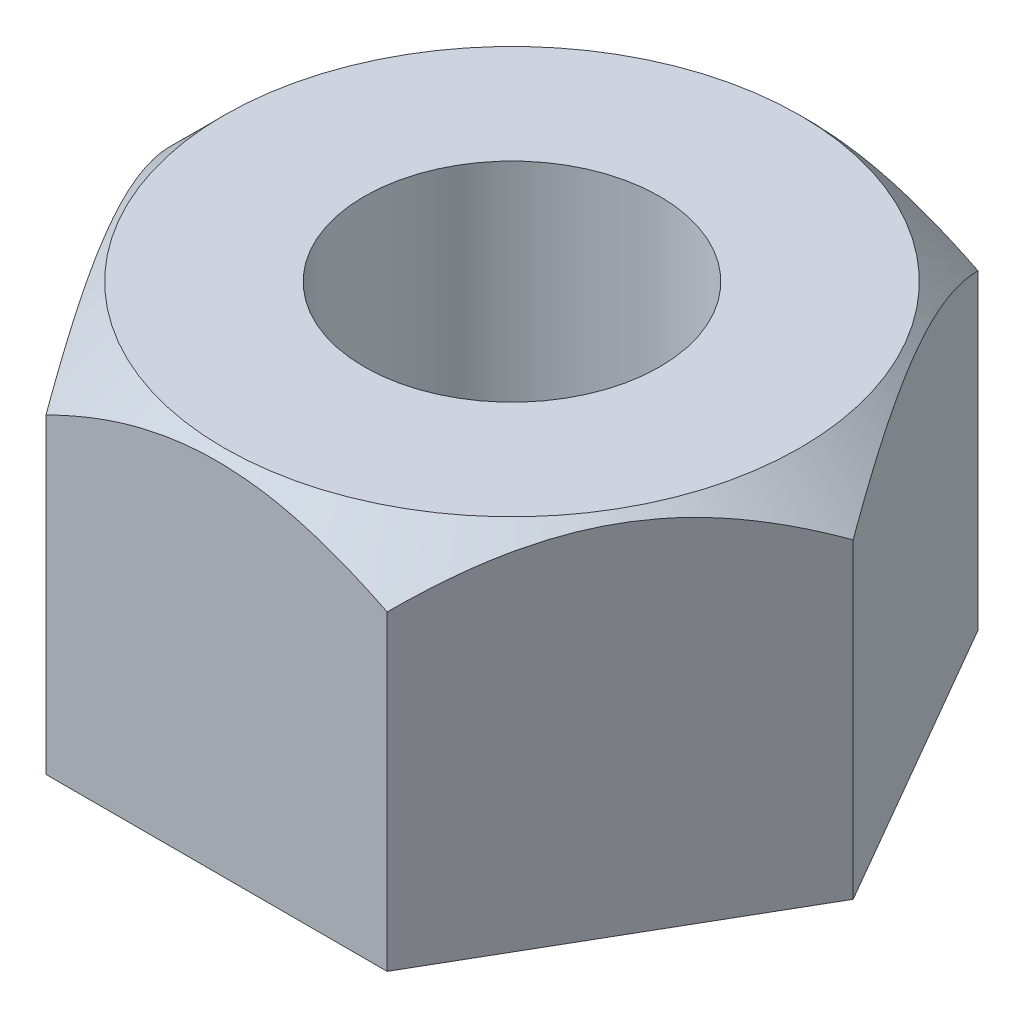
ISO-10303-21;
HEADER;
FILE_DESCRIPTION(('STEP AP214'),'2;1');
FILE_NAME('part.step','',(''),(''),'','','');
FILE_SCHEMA(('AUTOMOTIVE_DESIGN { 1 0 10303 214 1 1 1 1 }'));
ENDSEC;
DATA;
#1=APPLICATION_CONTEXT('core data for automotive mechanical design processes');
#2=APPLICATION_PROTOCOL_DEFINITION('international standard','automotive_design',2000,#1);
#3=PRODUCT_CONTEXT('',#1,'mechanical');
#4=PRODUCT('Part','Part','',(#3));
#5=PRODUCT_RELATED_PRODUCT_CATEGORY('part','',(#4));
#6=PRODUCT_DEFINITION_FORMATION('','',#4);
#7=PRODUCT_DEFINITION_CONTEXT('part definition',#1,'design');
#8=PRODUCT_DEFINITION('design','',#6,#7);
#9=PRODUCT_DEFINITION_SHAPE('','',#8);
#10=(LENGTH_UNIT() NAMED_UNIT(*) SI_UNIT(.MILLI.,.METRE.));
#11=(NAMED_UNIT(*) PLANE_ANGLE_UNIT() SI_UNIT($,.RADIAN.));
#12=(NAMED_UNIT(*) SI_UNIT($,.STERADIAN.) SOLID_ANGLE_UNIT());
#13=UNCERTAINTY_MEASURE_WITH_UNIT(LENGTH_MEASURE(1.E-05),#10,'distance_accuracy_value','');
#14=(GEOMETRIC_REPRESENTATION_CONTEXT(3) GLOBAL_UNCERTAINTY_ASSIGNED_CONTEXT((#13)) GLOBAL_UNIT_ASSIGNED_CONTEXT((#10,
#11,#12)) REPRESENTATION_CONTEXT('',''));
#15=CARTESIAN_POINT('',(0.,0.,0.));
#16=DIRECTION('',(0.,0.,1.));
#17=DIRECTION('',(1.,0.,0.));
#18=AXIS2_PLACEMENT_3D('',#15,#16,#17);
#19=CARTESIAN_POINT('',(0.,14.8,0.));
#20=DIRECTION('',(0.,1.,0.));
#21=DIRECTION('',(0.,0.,1.));
#22=AXIS2_PLACEMENT_3D('',#19,#20,#21);
#23=PLANE('',#22);
#24=CARTESIAN_POINT('',(0.,14.8,0.));
#25=DIRECTION('',(0.,1.,0.));
#26=DIRECTION('',(0.,0.,1.));
#27=AXIS2_PLACEMENT_3D('',#24,#25,#26);
#28=CIRCLE('',#27,6.);
#29=CARTESIAN_POINT('',(0.,14.8,6.));
#30=VERTEX_POINT('',#29);
#31=EDGE_CURVE('E153',#30,#30,#28,.T.);
#32=ORIENTED_EDGE('',*,*,#31,.F.);
#33=EDGE_LOOP('',(#32));
#34=FACE_BOUND('',#33,.T.);
#35=CARTESIAN_POINT('',(0.,14.8,0.));
#36=DIRECTION('',(0.,1.,0.));
#37=DIRECTION('',(0.,0.,1.));
#38=AXIS2_PLACEMENT_3D('',#35,#36,#37);
#39=CIRCLE('',#38,11.7);
#40=CARTESIAN_POINT('',(0.,14.8,11.7));
#41=VERTEX_POINT('',#40);
#42=EDGE_CURVE('E119',#41,#41,#39,.T.);
#43=ORIENTED_EDGE('',*,*,#42,.T.);
#44=EDGE_LOOP('',(#43));
#45=FACE_BOUND('',#44,.T.);
#46=ADVANCED_FACE('F55',(#34,#45),#23,.T.);
#47=CARTESIAN_POINT('',(6.92820323027558,14.8,-12.));
#48=DIRECTION('',(0.,0.,1.));
#49=DIRECTION('',(1.,0.,0.));
#50=AXIS2_PLACEMENT_3D('',#47,#48,#49);
#51=PLANE('',#50);
#52=CARTESIAN_POINT('',(-14.801412500091,7.44529422956486,-12.));
#53=CARTESIAN_POINT('',(-14.4450990872284,7.72201153026107,-12.));
#54=CARTESIAN_POINT('',(-14.0869052691551,7.99634489111884,-12.));
#55=CARTESIAN_POINT('',(-13.3659745275774,8.53914347458796,-12.));
#56=CARTESIAN_POINT('',(-13.0032365808891,8.80760733682356,-12.));
#57=CARTESIAN_POINT('',(-12.2697898339787,9.33947510440906,-12.));
#58=CARTESIAN_POINT('',(-11.8990411956306,9.60282424900944,-12.));
#59=CARTESIAN_POINT('',(-11.1514431459493,10.1206851252024,-12.));
#60=CARTESIAN_POINT('',(-10.7745941524791,10.3751974583757,-12.));
#61=CARTESIAN_POINT('',(-9.9883277604522,10.8899865053995,-12.));
#62=CARTESIAN_POINT('',(-9.57841641518277,11.14951253379,-12.));
#63=CARTESIAN_POINT('',(-8.74894806712837,11.652933114154,-12.));
#64=CARTESIAN_POINT('',(-8.32938940873377,11.8968249554727,-12.));
#65=CARTESIAN_POINT('',(-7.48043397523474,12.3638202415861,-12.));
#66=CARTESIAN_POINT('',(-7.05107095929579,12.5869845884765,-12.));
#67=CARTESIAN_POINT('',(-6.179988359866,13.0075245273671,-12.));
#68=CARTESIAN_POINT('',(-5.73827484835639,13.2049125304695,-12.));
#69=CARTESIAN_POINT('',(-4.88962319238687,13.5472255629299,-12.));
#70=CARTESIAN_POINT('',(-4.4840509613617,13.6955092491556,-12.));
#71=CARTESIAN_POINT('',(-3.66220026690907,13.9596409956595,-12.));
#72=CARTESIAN_POINT('',(-3.24592114793286,14.075487064699,-12.));
#73=CARTESIAN_POINT('',(-2.61903132937467,14.2191636497385,-12.));
#74=CARTESIAN_POINT('',(-2.41174791860351,14.2617582447969,-12.));
#75=CARTESIAN_POINT('',(-1.99538619814452,14.336954266384,-12.));
#76=CARTESIAN_POINT('',(-1.78630814978172,14.3695571233027,-12.));
#77=CARTESIAN_POINT('',(-1.36679404933553,14.4242029069739,-12.));
#78=CARTESIAN_POINT('',(-1.1563581354994,14.4462468920781,-12.));
#79=CARTESIAN_POINT('',(-0.734621944734772,14.4793724167482,-12.));
#80=CARTESIAN_POINT('',(-0.523321681191196,14.4904541254305,-12.));
#81=CARTESIAN_POINT('',(-0.110604144780084,14.501177353214,-12.));
#82=CARTESIAN_POINT('',(0.0907996117344343,14.5013435283368,-12.));
#83=CARTESIAN_POINT('',(0.493382262326179,14.4915477648453,-12.));
#84=CARTESIAN_POINT('',(0.694561128520425,14.4815846854314,-12.));
#85=CARTESIAN_POINT('',(1.09616438993495,14.4517018314411,-12.));
#86=CARTESIAN_POINT('',(1.29658883265054,14.4317826945877,-12.));
#87=CARTESIAN_POINT('',(1.6962575621275,14.3823303146465,-12.));
#88=CARTESIAN_POINT('',(1.89550168379105,14.3527957574866,-12.));
#89=CARTESIAN_POINT('',(2.49810838310559,14.2491914186656,-12.));
#90=CARTESIAN_POINT('',(2.89905404316259,14.1606853181106,-12.));
#91=CARTESIAN_POINT('',(3.69198154856619,13.9507279381252,-12.));
#92=CARTESIAN_POINT('',(4.08396376805102,13.8292780365163,-12.));
#93=CARTESIAN_POINT('',(4.87417783007714,13.5533826315198,-12.));
#94=CARTESIAN_POINT('',(5.27200353161047,13.3977854015761,-12.));
#95=CARTESIAN_POINT('',(6.05745310690751,13.0624974253596,-12.));
#96=CARTESIAN_POINT('',(6.4450723555116,12.8827959733822,-12.));
#97=CARTESIAN_POINT('',(7.21192138045324,12.503557457937,-12.));
#98=CARTESIAN_POINT('',(7.59112097676443,12.3039598559697,-12.));
#99=CARTESIAN_POINT('',(8.34084461503845,11.8893130198286,-12.));
#100=CARTESIAN_POINT('',(8.71136996298692,11.6742661317791,-12.));
#101=CARTESIAN_POINT('',(9.42679916335699,11.2426328306664,-12.));
#102=CARTESIAN_POINT('',(9.77206580095679,11.0266445609616,-12.));
#103=CARTESIAN_POINT('',(10.4566659285482,10.5854343964853,-12.));
#104=CARTESIAN_POINT('',(10.7959989733113,10.3602118130199,-12.));
#105=CARTESIAN_POINT('',(11.4667906374197,9.90400044379855,-12.));
#106=CARTESIAN_POINT('',(11.7982905056502,9.67307209021432,-12.));
#107=CARTESIAN_POINT('',(12.4567365082155,9.20499456707331,-12.));
#108=CARTESIAN_POINT('',(12.7836838730967,8.96784713055429,-12.));
#109=CARTESIAN_POINT('',(13.1087202789976,8.72815295606545,-12.));
#110=B_SPLINE_CURVE_WITH_KNOTS('',3,(#52,#53,#54,#55,#56,#57,#58,#59,#60,#61,#62,#63,#64,#65,
#66,#67,#68,#69,#70,#71,#72,#73,#74,#75,#76,#77,#78,#79,#80,#81,#82,#83,#84,#85,#86,#87,#88,#89,
#90,#91,#92,#93,#94,#95,#96,#97,#98,#99,#100,#101,#102,#103,#104,#105,#106,#107,#108,#109),
.UNSPECIFIED.,.F.,.F.,(4,2,2,2,2,2,2,2,2,2,2,2,2,2,2,2,2,2,2,2,2,2,2,2,2,2,2,2,4),(0.,
1.35345851995285,2.70722747546976,4.07140305034779,5.43548557387311,6.89069127235449,
8.34614859573043,9.79718439558518,11.247518936881,12.5419494153501,13.8364593372402,
14.4711005682753,15.1056509033139,15.7401376218939,16.3746145520171,16.9785718174019,
17.582597110546,18.1865837185503,18.790652903841,20.0206411275807,21.2505779169717,
22.531105826439,23.8122043674222,25.0973273701481,26.3822556253048,27.6038609068686,
28.8255574619077,30.0374950118827,31.2490983532025),.UNSPECIFIED.);
#111=CARTESIAN_POINT('',(6.92820323027558,12.6435935394489,-12.));
#112=VERTEX_POINT('',#111);
#113=CARTESIAN_POINT('',(-6.92820323027552,12.6435935394489,-12.));
#114=VERTEX_POINT('',#113);
#115=EDGE_CURVE('E114',#112,#114,#110,.F.);
#116=ORIENTED_EDGE('',*,*,#115,.F.);
#117=DIRECTION('',(0.,-1.,0.));
#118=VECTOR('',#117,1.);
#119=CARTESIAN_POINT('',(6.92820323027558,14.8,-12.));
#120=LINE('',#119,#118);
#121=CARTESIAN_POINT('',(6.92820323027558,0.,-12.));
#122=VERTEX_POINT('',#121);
#123=EDGE_CURVE('E84',#112,#122,#120,.T.);
#124=ORIENTED_EDGE('',*,*,#123,.T.);
#125=DIRECTION('',(-1.,0.,0.));
#126=VECTOR('',#125,1.);
#127=CARTESIAN_POINT('',(6.92820323027558,0.,-12.));
#128=LINE('',#127,#126);
#129=CARTESIAN_POINT('',(-6.92820323027552,0.,-12.));
#130=VERTEX_POINT('',#129);
#131=EDGE_CURVE('E148',#122,#130,#128,.T.);
#132=ORIENTED_EDGE('',*,*,#131,.T.);
#133=DIRECTION('',(0.,-1.,0.));
#134=VECTOR('',#133,1.);
#135=CARTESIAN_POINT('',(-6.92820323027552,14.8,-12.));
#136=LINE('',#135,#134);
#137=EDGE_CURVE('E70',#114,#130,#136,.T.);
#138=ORIENTED_EDGE('',*,*,#137,.F.);
#139=EDGE_LOOP('',(#116,#124,#132,#138));
#140=FACE_BOUND('',#139,.T.);
#141=ADVANCED_FACE('F57',(#140),#51,.F.);
#142=CARTESIAN_POINT('',(-6.92820323027552,14.8,-12.));
#143=DIRECTION('',(0.866025403784439,0.,0.499999999999999));
#144=DIRECTION('',(0.499999999999999,0.,-0.866025403784439));
#145=AXIS2_PLACEMENT_3D('',#142,#143,#144);
#146=PLANE('',#145);
#147=CARTESIAN_POINT('',(-6.92808776022168,12.6434780679517,-12.0002));
#148=CARTESIAN_POINT('',(-7.04719877327456,12.7625714926538,-11.7938936736514));
#149=CARTESIAN_POINT('',(-7.16724261422503,12.8780308165856,-11.5859716419895));
#150=CARTESIAN_POINT('',(-7.40934115077743,13.1005268939468,-11.1666446762427));
#151=CARTESIAN_POINT('',(-7.5313969011812,13.2075590475927,-10.9552379151874));
#152=CARTESIAN_POINT('',(-7.77824013911251,13.4124996903972,-10.5276928855855));
#153=CARTESIAN_POINT('',(-7.90303926622942,13.510352431954,-10.3115344566788));
#154=CARTESIAN_POINT('',(-8.15468728442037,13.6948089974753,-9.87566730354805));
#155=CARTESIAN_POINT('',(-8.2815358587729,13.7814145412342,-9.6559591279018));
#156=CARTESIAN_POINT('',(-8.53524327762006,13.9406365264619,-9.21652498820136));
#157=CARTESIAN_POINT('',(-8.66207094520615,14.0134505386415,-8.99685302413679));
#158=CARTESIAN_POINT('',(-8.91750415833688,14.1452735919672,-8.55442972105379));
#159=CARTESIAN_POINT('',(-9.04610951090115,14.204284119307,-8.33167871628717));
#160=CARTESIAN_POINT('',(-9.30454801721049,14.3070145675144,-7.88405009272718));
#161=CARTESIAN_POINT('',(-9.43437771980113,14.3507689052205,-7.65917845150863));
#162=CARTESIAN_POINT('',(-9.69512706759185,14.4220255403133,-7.20754733309465));
#163=CARTESIAN_POINT('',(-9.82604654695932,14.4495302661784,-6.98078814312973));
#164=CARTESIAN_POINT('',(-10.1450873372795,14.4956480494336,-6.42819328460833));
#165=CARTESIAN_POINT('',(-10.3335534889187,14.5053256947163,-6.10176033446225));
#166=CARTESIAN_POINT('',(-10.7101449262483,14.4890810450968,-5.44948483131199));
#167=CARTESIAN_POINT('',(-10.8982700693165,14.4631462715612,-5.12364252533668));
#168=CARTESIAN_POINT('',(-11.272746976892,14.3772075994838,-4.47502949515454));
#169=CARTESIAN_POINT('',(-11.459096521137,14.3171656055892,-4.152262616555));
#170=CARTESIAN_POINT('',(-11.8285926127853,14.1662761774216,-3.51227661262201));
#171=CARTESIAN_POINT('',(-12.0117394046794,14.0754311054756,-3.19505706381805));
#172=CARTESIAN_POINT('',(-12.33684690702,13.8885415621697,-2.63195435184247));
#173=CARTESIAN_POINT('',(-12.4795277124444,13.7974135849289,-2.38482394758251));
#174=CARTESIAN_POINT('',(-12.7623282250606,13.6004736817299,-1.89499909132463));
#175=CARTESIAN_POINT('',(-12.9024478546601,13.4946613117313,-1.65230477372055));
#176=CARTESIAN_POINT('',(-13.1796846729289,13.2707242880093,-1.17211651875028));
#177=CARTESIAN_POINT('',(-13.3168097461332,13.1526383555986,-0.934608924968879));
#178=CARTESIAN_POINT('',(-13.5885209197265,12.90570429574,-0.463991367321183));
#179=CARTESIAN_POINT('',(-13.7231085155155,12.7768627663692,-0.230878813345964));
#180=CARTESIAN_POINT('',(-13.8565219306048,12.6434780679517,0.000199999999997512));
#181=B_SPLINE_CURVE_WITH_KNOTS('',3,(#147,#148,#149,#150,#151,#152,#153,#154,#155,#156,#157,
#158,#159,#160,#161,#162,#163,#164,#165,#166,#167,#168,#169,#170,#171,#172,#173,#174,#175,#176,
#177,#178,#179,#180),.UNSPECIFIED.,.F.,.F.,(4,2,2,2,2,2,2,2,2,2,2,2,2,2,2,2,4),(0.,
0.799031199908986,1.59849555255348,2.40253734668171,3.20645605070684,3.99780391077672,
4.78906652873795,5.57853238867789,6.36788023433998,7.4972868016245,8.62708921530181,
9.75815602658374,10.8891361145372,11.7873913517247,12.6856737571236,13.58120361047,
14.4761880775557),.UNSPECIFIED.);
#182=CARTESIAN_POINT('',(-13.856406460551,12.643593539449,0.));
#183=VERTEX_POINT('',#182);
#184=EDGE_CURVE('E120',#114,#183,#181,.T.);
#185=ORIENTED_EDGE('',*,*,#184,.F.);
#186=ORIENTED_EDGE('',*,*,#137,.T.);
#187=DIRECTION('',(-0.499999999999999,0.,0.866025403784439));
#188=VECTOR('',#187,1.);
#189=CARTESIAN_POINT('',(-6.92820323027552,0.,-12.));
#190=LINE('',#189,#188);
#191=CARTESIAN_POINT('',(-13.856406460551,0.,0.));
#192=VERTEX_POINT('',#191);
#193=EDGE_CURVE('E143',#130,#192,#190,.T.);
#194=ORIENTED_EDGE('',*,*,#193,.T.);
#195=DIRECTION('',(0.,-1.,0.));
#196=VECTOR('',#195,1.);
#197=CARTESIAN_POINT('',(-13.856406460551,14.8,0.));
#198=LINE('',#197,#196);
#199=EDGE_CURVE('E137',#183,#192,#198,.T.);
#200=ORIENTED_EDGE('',*,*,#199,.F.);
#201=EDGE_LOOP('',(#185,#186,#194,#200));
#202=FACE_BOUND('',#201,.T.);
#203=ADVANCED_FACE('F141',(#202),#146,.F.);
#204=CARTESIAN_POINT('',(-13.856406460551,14.8,0.));
#205=DIRECTION('',(0.86602540378444,0.,-0.499999999999998));
#206=DIRECTION('',(-0.499999999999998,0.,-0.86602540378444));
#207=AXIS2_PLACEMENT_3D('',#204,#205,#206);
#208=PLANE('',#207);
#209=CARTESIAN_POINT('',(-13.8565219306048,12.6434780679518,-0.000200000000003469));
#210=CARTESIAN_POINT('',(-13.737410917552,12.7625714926539,0.206106326348585));
#211=CARTESIAN_POINT('',(-13.6173670766015,12.8780308165856,0.414028358010507));
#212=CARTESIAN_POINT('',(-13.3752685400491,13.1005268939468,0.833355323757333));
#213=CARTESIAN_POINT('',(-13.2532127896453,13.2075590475927,1.04476208481262));
#214=CARTESIAN_POINT('',(-13.006369551714,13.4124996903972,1.47230711441446));
#215=CARTESIAN_POINT('',(-12.8815704245971,13.510352431954,1.68846554332119));
#216=CARTESIAN_POINT('',(-12.6299224064062,13.6948089974754,2.12433269645194));
#217=CARTESIAN_POINT('',(-12.5030738320536,13.7814145412342,2.34404087209819));
#218=CARTESIAN_POINT('',(-12.2493664132065,13.9406365264619,2.78347501179863));
#219=CARTESIAN_POINT('',(-12.1225387456204,14.0134505386415,3.00314697586319));
#220=CARTESIAN_POINT('',(-11.8671055324897,14.1452735919672,3.44557027894619));
#221=CARTESIAN_POINT('',(-11.7385001799254,14.204284119307,3.66832128371281));
#222=CARTESIAN_POINT('',(-11.480061673616,14.3070145675144,4.1159499072728));
#223=CARTESIAN_POINT('',(-11.3502319710254,14.3507689052206,4.34082154849135));
#224=CARTESIAN_POINT('',(-11.0894826232347,14.4220255403133,4.79245266690532));
#225=CARTESIAN_POINT('',(-10.9585631438672,14.4495302661784,5.01921185687024));
#226=CARTESIAN_POINT('',(-10.6395223535471,14.4956480494336,5.57180671539163));
#227=CARTESIAN_POINT('',(-10.4510562019079,14.5053256947163,5.89823966553772));
#228=CARTESIAN_POINT('',(-10.0744647645783,14.4890810450968,6.55051516868798));
#229=CARTESIAN_POINT('',(-9.88633962151007,14.4631462715612,6.87635747466329));
#230=CARTESIAN_POINT('',(-9.51186271393452,14.3772075994838,7.52497050484543));
#231=CARTESIAN_POINT('',(-9.32551316968958,14.3171656055892,7.84773738344497));
#232=CARTESIAN_POINT('',(-8.95601707804128,14.1662761774216,8.48772338737797));
#233=CARTESIAN_POINT('',(-8.77287028614711,14.0754311054756,8.80494293618192));
#234=CARTESIAN_POINT('',(-8.44776278380659,13.8885415621697,9.36804564815751));
#235=CARTESIAN_POINT('',(-8.30508197838216,13.7974135849289,9.61517605241747));
#236=CARTESIAN_POINT('',(-8.02228146576591,13.6004736817299,10.1050009086754));
#237=CARTESIAN_POINT('',(-7.88216183616639,13.4946613117313,10.3476952262794));
#238=CARTESIAN_POINT('',(-7.60492501789761,13.2707242880093,10.8278834812497));
#239=CARTESIAN_POINT('',(-7.46779994469334,13.1526383555986,11.0653910750311));
#240=CARTESIAN_POINT('',(-7.19608877110008,12.90570429574,11.5360086326788));
#241=CARTESIAN_POINT('',(-7.061501175311,12.7768627663692,11.769121186654));
#242=CARTESIAN_POINT('',(-6.92808776022169,12.6434780679517,12.0002));
#243=B_SPLINE_CURVE_WITH_KNOTS('',3,(#209,#210,#211,#212,#213,#214,#215,#216,#217,#218,#219,
#220,#221,#222,#223,#224,#225,#226,#227,#228,#229,#230,#231,#232,#233,#234,#235,#236,#237,#238,
#239,#240,#241,#242),.UNSPECIFIED.,.F.,.F.,(4,2,2,2,2,2,2,2,2,2,2,2,2,2,2,2,4),(0.,
0.799031199908981,1.59849555255347,2.4025373466817,3.20645605070682,3.99780391077669,
4.78906652873792,5.57853238867786,6.36788023433993,7.49728680162445,8.62708921530177,
9.7581560265837,10.8891361145371,11.7873913517247,12.6856737571236,13.58120361047,
14.4761880775557),.UNSPECIFIED.);
#244=CARTESIAN_POINT('',(-6.92820323027553,12.6435935394489,12.));
#245=VERTEX_POINT('',#244);
#246=EDGE_CURVE('E176',#183,#245,#243,.T.);
#247=ORIENTED_EDGE('',*,*,#246,.F.);
#248=ORIENTED_EDGE('',*,*,#199,.T.);
#249=DIRECTION('',(0.499999999999998,0.,0.86602540378444));
#250=VECTOR('',#249,1.);
#251=CARTESIAN_POINT('',(-13.856406460551,0.,0.));
#252=LINE('',#251,#250);
#253=CARTESIAN_POINT('',(-6.92820323027553,0.,12.));
#254=VERTEX_POINT('',#253);
#255=EDGE_CURVE('E151',#192,#254,#252,.T.);
#256=ORIENTED_EDGE('',*,*,#255,.T.);
#257=DIRECTION('',(0.,-1.,0.));
#258=VECTOR('',#257,1.);
#259=CARTESIAN_POINT('',(-6.92820323027553,14.8,12.));
#260=LINE('',#259,#258);
#261=EDGE_CURVE('E135',#245,#254,#260,.T.);
#262=ORIENTED_EDGE('',*,*,#261,.F.);
#263=EDGE_LOOP('',(#247,#248,#256,#262));
#264=FACE_BOUND('',#263,.T.);
#265=ADVANCED_FACE('F175',(#264),#208,.F.);
#266=CARTESIAN_POINT('',(-6.92820323027553,14.8,12.));
#267=DIRECTION('',(0.,0.,-1.));
#268=DIRECTION('',(-1.,0.,0.));
#269=AXIS2_PLACEMENT_3D('',#266,#267,#268);
#270=PLANE('',#269);
#271=CARTESIAN_POINT('',(-14.801412500091,7.44529422956483,12.));
#272=CARTESIAN_POINT('',(-14.4450990872285,7.72201153026103,12.));
#273=CARTESIAN_POINT('',(-14.0869052691551,7.99634489111881,12.));
#274=CARTESIAN_POINT('',(-13.3659745275774,8.53914347458794,12.));
#275=CARTESIAN_POINT('',(-13.0032365808891,8.80760733682354,12.));
#276=CARTESIAN_POINT('',(-12.2697898339788,9.33947510440904,12.));
#277=CARTESIAN_POINT('',(-11.8990411956306,9.60282424900942,12.));
#278=CARTESIAN_POINT('',(-11.1514431459493,10.1206851252024,12.));
#279=CARTESIAN_POINT('',(-10.7745941524791,10.3751974583756,12.));
#280=CARTESIAN_POINT('',(-9.98832776045223,10.8899865053995,12.));
#281=CARTESIAN_POINT('',(-9.5784164151828,11.14951253379,12.));
#282=CARTESIAN_POINT('',(-8.7489480671284,11.652933114154,12.));
#283=CARTESIAN_POINT('',(-8.32938940873379,11.8968249554727,12.));
#284=CARTESIAN_POINT('',(-7.48043397523476,12.3638202415861,12.));
#285=CARTESIAN_POINT('',(-7.0510709592958,12.5869845884765,12.));
#286=CARTESIAN_POINT('',(-6.17998835986602,13.0075245273671,12.));
#287=CARTESIAN_POINT('',(-5.7382748483564,13.2049125304695,12.));
#288=CARTESIAN_POINT('',(-4.88962319238689,13.5472255629299,12.));
#289=CARTESIAN_POINT('',(-4.48405096136172,13.6955092491556,12.));
#290=CARTESIAN_POINT('',(-3.66220026690908,13.9596409956595,12.));
#291=CARTESIAN_POINT('',(-3.24592114793287,14.075487064699,12.));
#292=CARTESIAN_POINT('',(-2.61903132937468,14.2191636497385,12.));
#293=CARTESIAN_POINT('',(-2.41174791860352,14.2617582447969,12.));
#294=CARTESIAN_POINT('',(-1.99538619814453,14.336954266384,12.));
#295=CARTESIAN_POINT('',(-1.78630814978174,14.3695571233027,12.));
#296=CARTESIAN_POINT('',(-1.36679404933555,14.4242029069739,12.));
#297=CARTESIAN_POINT('',(-1.15635813549942,14.4462468920781,12.));
#298=CARTESIAN_POINT('',(-0.734621944734785,14.4793724167482,12.));
#299=CARTESIAN_POINT('',(-0.523321681191208,14.4904541254305,12.));
#300=CARTESIAN_POINT('',(-0.110604144780093,14.501177353214,12.));
#301=CARTESIAN_POINT('',(0.0907996117344258,14.5013435283368,12.));
#302=CARTESIAN_POINT('',(0.493382262326172,14.4915477648453,12.));
#303=CARTESIAN_POINT('',(0.694561128520418,14.4815846854314,12.));
#304=CARTESIAN_POINT('',(1.09616438993494,14.4517018314411,12.));
#305=CARTESIAN_POINT('',(1.29658883265053,14.4317826945877,12.));
#306=CARTESIAN_POINT('',(1.69625756212749,14.3823303146465,12.));
#307=CARTESIAN_POINT('',(1.89550168379105,14.3527957574866,12.));
#308=CARTESIAN_POINT('',(2.49810838310559,14.2491914186656,12.));
#309=CARTESIAN_POINT('',(2.89905404316258,14.1606853181106,12.));
#310=CARTESIAN_POINT('',(3.69198154856618,13.9507279381252,12.));
#311=CARTESIAN_POINT('',(4.08396376805101,13.8292780365164,12.));
#312=CARTESIAN_POINT('',(4.87417783007713,13.5533826315198,12.));
#313=CARTESIAN_POINT('',(5.27200353161047,13.3977854015761,12.));
#314=CARTESIAN_POINT('',(6.0574531069075,13.0624974253596,12.));
#315=CARTESIAN_POINT('',(6.44507235551159,12.8827959733822,12.));
#316=CARTESIAN_POINT('',(7.21192138045323,12.503557457937,12.));
#317=CARTESIAN_POINT('',(7.59112097676442,12.3039598559698,12.));
#318=CARTESIAN_POINT('',(8.34084461503844,11.8893130198286,12.));
#319=CARTESIAN_POINT('',(8.71136996298691,11.6742661317791,12.));
#320=CARTESIAN_POINT('',(9.42679916335698,11.2426328306664,12.));
#321=CARTESIAN_POINT('',(9.77206580095678,11.0266445609616,12.));
#322=CARTESIAN_POINT('',(10.4566659285482,10.5854343964853,12.));
#323=CARTESIAN_POINT('',(10.7959989733113,10.3602118130199,12.));
#324=CARTESIAN_POINT('',(11.4667906374197,9.90400044379857,12.));
#325=CARTESIAN_POINT('',(11.7982905056502,9.67307209021433,12.));
#326=CARTESIAN_POINT('',(12.4567365082155,9.20499456707333,12.));
#327=CARTESIAN_POINT('',(12.7836838730967,8.9678471305543,12.));
#328=CARTESIAN_POINT('',(13.1087202789976,8.72815295606546,12.));
#329=B_SPLINE_CURVE_WITH_KNOTS('',3,(#271,#272,#273,#274,#275,#276,#277,#278,#279,#280,#281,
#282,#283,#284,#285,#286,#287,#288,#289,#290,#291,#292,#293,#294,#295,#296,#297,#298,#299,#300,
#301,#302,#303,#304,#305,#306,#307,#308,#309,#310,#311,#312,#313,#314,#315,#316,#317,#318,#319,
#320,#321,#322,#323,#324,#325,#326,#327,#328),.UNSPECIFIED.,.F.,.F.,(4,2,2,2,2,2,2,2,2,2,2,2,2,
2,2,2,2,2,2,2,2,2,2,2,2,2,2,2,4),(0.,1.35345851995285,2.70722747546976,4.0714030503478,
5.43548557387313,6.89069127235451,8.34614859573045,9.79718439558521,11.247518936881,
12.5419494153501,13.8364593372402,14.4711005682754,15.1056509033139,15.7401376218939,
16.3746145520172,16.978571817402,17.5825971105461,18.1865837185503,18.7906529038411,
20.0206411275807,21.2505779169718,22.5311058264391,23.8122043674222,25.0973273701481,
26.3822556253048,27.6038609068686,28.8255574619077,30.0374950118828,31.2490983532025),.UNSPECIFIED.);
#330=CARTESIAN_POINT('',(6.92820323027552,12.6435935394489,12.));
#331=VERTEX_POINT('',#330);
#332=EDGE_CURVE('E172',#245,#331,#329,.T.);
#333=ORIENTED_EDGE('',*,*,#332,.F.);
#334=ORIENTED_EDGE('',*,*,#261,.T.);
#335=DIRECTION('',(1.,0.,0.));
#336=VECTOR('',#335,1.);
#337=CARTESIAN_POINT('',(-6.92820323027553,0.,12.));
#338=LINE('',#337,#336);
#339=CARTESIAN_POINT('',(6.92820323027552,0.,12.));
#340=VERTEX_POINT('',#339);
#341=EDGE_CURVE('E161',#254,#340,#338,.T.);
#342=ORIENTED_EDGE('',*,*,#341,.T.);
#343=DIRECTION('',(0.,-1.,0.));
#344=VECTOR('',#343,1.);
#345=CARTESIAN_POINT('',(6.92820323027552,14.8,12.));
#346=LINE('',#345,#344);
#347=EDGE_CURVE('E128',#331,#340,#346,.T.);
#348=ORIENTED_EDGE('',*,*,#347,.F.);
#349=EDGE_LOOP('',(#333,#334,#342,#348));
#350=FACE_BOUND('',#349,.T.);
#351=ADVANCED_FACE('F170',(#350),#270,.F.);
#352=CARTESIAN_POINT('',(6.92820323027552,14.8,12.));
#353=DIRECTION('',(-0.866025403784439,0.,-0.499999999999999));
#354=DIRECTION('',(-0.499999999999999,0.,0.866025403784439));
#355=AXIS2_PLACEMENT_3D('',#352,#353,#354);
#356=PLANE('',#355);
#357=CARTESIAN_POINT('',(6.92808776022168,12.6434780679517,12.0002));
#358=CARTESIAN_POINT('',(7.04719877327456,12.7625714926538,11.7938936736514));
#359=CARTESIAN_POINT('',(7.16724261422503,12.8780308165856,11.5859716419895));
#360=CARTESIAN_POINT('',(7.40934115077743,13.1005268939468,11.1666446762427));
#361=CARTESIAN_POINT('',(7.5313969011812,13.2075590475927,10.9552379151874));
#362=CARTESIAN_POINT('',(7.77824013911252,13.4124996903972,10.5276928855855));
#363=CARTESIAN_POINT('',(7.90303926622942,13.510352431954,10.3115344566788));
#364=CARTESIAN_POINT('',(8.15468728442037,13.6948089974753,9.87566730354805));
#365=CARTESIAN_POINT('',(8.2815358587729,13.7814145412342,9.6559591279018));
#366=CARTESIAN_POINT('',(8.53524327762006,13.9406365264619,9.21652498820136));
#367=CARTESIAN_POINT('',(8.66207094520615,14.0134505386415,8.99685302413679));
#368=CARTESIAN_POINT('',(8.91750415833688,14.1452735919672,8.55442972105379));
#369=CARTESIAN_POINT('',(9.04610951090115,14.204284119307,8.33167871628718));
#370=CARTESIAN_POINT('',(9.30454801721049,14.3070145675144,7.88405009272718));
#371=CARTESIAN_POINT('',(9.43437771980113,14.3507689052205,7.65917845150863));
#372=CARTESIAN_POINT('',(9.69512706759185,14.4220255403133,7.20754733309466));
#373=CARTESIAN_POINT('',(9.82604654695932,14.4495302661784,6.98078814312974));
#374=CARTESIAN_POINT('',(10.1450873372795,14.4956480494336,6.42819328460834));
#375=CARTESIAN_POINT('',(10.3335534889187,14.5053256947163,6.10176033446226));
#376=CARTESIAN_POINT('',(10.7101449262483,14.4890810450968,5.44948483131199));
#377=CARTESIAN_POINT('',(10.8982700693165,14.4631462715612,5.12364252533668));
#378=CARTESIAN_POINT('',(11.272746976892,14.3772075994838,4.47502949515454));
#379=CARTESIAN_POINT('',(11.459096521137,14.3171656055892,4.15226261655501));
#380=CARTESIAN_POINT('',(11.8285926127853,14.1662761774216,3.51227661262201));
#381=CARTESIAN_POINT('',(12.0117394046794,14.0754311054756,3.19505706381806));
#382=CARTESIAN_POINT('',(12.33684690702,13.8885415621697,2.63195435184247));
#383=CARTESIAN_POINT('',(12.4795277124444,13.7974135849289,2.38482394758252));
#384=CARTESIAN_POINT('',(12.7623282250606,13.6004736817299,1.89499909132466));
#385=CARTESIAN_POINT('',(12.9024478546601,13.4946613117313,1.65230477372057));
#386=CARTESIAN_POINT('',(13.1796846729289,13.2707242880093,1.17211651875032));
#387=CARTESIAN_POINT('',(13.3168097461332,13.1526383555986,0.93460892496892));
#388=CARTESIAN_POINT('',(13.5885209197264,12.90570429574,0.463991367321232));
#389=CARTESIAN_POINT('',(13.7231085155155,12.7768627663692,0.230878813346016));
#390=CARTESIAN_POINT('',(13.8565219306048,12.6434780679518,-0.000199999999942092));
#391=B_SPLINE_CURVE_WITH_KNOTS('',3,(#357,#358,#359,#360,#361,#362,#363,#364,#365,#366,#367,
#368,#369,#370,#371,#372,#373,#374,#375,#376,#377,#378,#379,#380,#381,#382,#383,#384,#385,#386,
#387,#388,#389,#390),.UNSPECIFIED.,.F.,.F.,(4,2,2,2,2,2,2,2,2,2,2,2,2,2,2,2,4),(0.,
0.799031199908984,1.59849555255348,2.40253734668171,3.20645605070683,3.99780391077672,
4.78906652873794,5.57853238867788,6.36788023433997,7.49728680162449,8.6270892153018,
9.75815602658373,10.8891361145372,11.7873913517247,12.6856737571236,13.58120361047,
14.4761880775557),.UNSPECIFIED.);
#392=CARTESIAN_POINT('',(13.856406460551,12.643593539449,0.));
#393=VERTEX_POINT('',#392);
#394=EDGE_CURVE('E76',#331,#393,#391,.T.);
#395=ORIENTED_EDGE('',*,*,#394,.F.);
#396=ORIENTED_EDGE('',*,*,#347,.T.);
#397=DIRECTION('',(0.499999999999999,0.,-0.866025403784439));
#398=VECTOR('',#397,1.);
#399=CARTESIAN_POINT('',(6.92820323027552,0.,12.));
#400=LINE('',#399,#398);
#401=CARTESIAN_POINT('',(13.856406460551,0.,0.));
#402=VERTEX_POINT('',#401);
#403=EDGE_CURVE('E130',#340,#402,#400,.T.);
#404=ORIENTED_EDGE('',*,*,#403,.T.);
#405=DIRECTION('',(0.,-1.,0.));
#406=VECTOR('',#405,1.);
#407=CARTESIAN_POINT('',(13.856406460551,14.8,0.));
#408=LINE('',#407,#406);
#409=EDGE_CURVE('E126',#393,#402,#408,.T.);
#410=ORIENTED_EDGE('',*,*,#409,.F.);
#411=EDGE_LOOP('',(#395,#396,#404,#410));
#412=FACE_BOUND('',#411,.T.);
#413=ADVANCED_FACE('F166',(#412),#356,.F.);
#414=CARTESIAN_POINT('',(13.856406460551,14.8,0.));
#415=DIRECTION('',(-0.866025403784443,0.,0.499999999999992));
#416=DIRECTION('',(0.499999999999992,0.,0.866025403784443));
#417=AXIS2_PLACEMENT_3D('',#414,#415,#416);
#418=PLANE('',#417);
#419=CARTESIAN_POINT('',(13.8565219306048,12.6434780679518,0.000200000000057246));
#420=CARTESIAN_POINT('',(13.7374109175519,12.7625714926539,-0.20610632634853));
#421=CARTESIAN_POINT('',(13.6173670766015,12.8780308165856,-0.414028358010451));
#422=CARTESIAN_POINT('',(13.3752685400491,13.1005268939468,-0.833355323757276));
#423=CARTESIAN_POINT('',(13.2532127896453,13.2075590475927,-1.04476208481256));
#424=CARTESIAN_POINT('',(13.006369551714,13.4124996903973,-1.47230711441441));
#425=CARTESIAN_POINT('',(12.8815704245971,13.510352431954,-1.68846554332113));
#426=CARTESIAN_POINT('',(12.6299224064062,13.6948089974754,-2.12433269645188));
#427=CARTESIAN_POINT('',(12.5030738320536,13.7814145412343,-2.34404087209813));
#428=CARTESIAN_POINT('',(12.2493664132065,13.9406365264619,-2.78347501179856));
#429=CARTESIAN_POINT('',(12.1225387456204,14.0134505386415,-3.00314697586313));
#430=CARTESIAN_POINT('',(11.8671055324897,14.1452735919672,-3.44557027894613));
#431=CARTESIAN_POINT('',(11.7385001799254,14.204284119307,-3.66832128371274));
#432=CARTESIAN_POINT('',(11.4800616736161,14.3070145675144,-4.11594990727273));
#433=CARTESIAN_POINT('',(11.3502319710254,14.3507689052206,-4.34082154849128));
#434=CARTESIAN_POINT('',(11.0894826232347,14.4220255403133,-4.79245266690525));
#435=CARTESIAN_POINT('',(10.9585631438673,14.4495302661784,-5.01921185687017));
#436=CARTESIAN_POINT('',(10.6395223535471,14.4956480494336,-5.57180671539157));
#437=CARTESIAN_POINT('',(10.4510562019079,14.5053256947163,-5.89823966553765));
#438=CARTESIAN_POINT('',(10.0744647645783,14.4890810450968,-6.55051516868792));
#439=CARTESIAN_POINT('',(9.88633962151012,14.4631462715612,-6.87635747466323));
#440=CARTESIAN_POINT('',(9.51186271393457,14.3772075994838,-7.52497050484537));
#441=CARTESIAN_POINT('',(9.32551316968964,14.3171656055892,-7.84773738344491));
#442=CARTESIAN_POINT('',(8.95601707804133,14.1662761774216,-8.48772338737791));
#443=CARTESIAN_POINT('',(8.77287028614717,14.0754311054756,-8.80494293618186));
#444=CARTESIAN_POINT('',(8.44776278380665,13.8885415621697,-9.36804564815746));
#445=CARTESIAN_POINT('',(8.30508197838222,13.7974135849289,-9.61517605241743));
#446=CARTESIAN_POINT('',(8.02228146576597,13.6004736817299,-10.1050009086753));
#447=CARTESIAN_POINT('',(7.88216183616645,13.4946613117313,-10.3476952262794));
#448=CARTESIAN_POINT('',(7.60492501789767,13.2707242880092,-10.8278834812497));
#449=CARTESIAN_POINT('',(7.4677999446934,13.1526383555985,-11.0653910750311));
#450=CARTESIAN_POINT('',(7.19608877110013,12.90570429574,-11.5360086326788));
#451=CARTESIAN_POINT('',(7.06150117531106,12.7768627663692,-11.769121186654));
#452=CARTESIAN_POINT('',(6.92808776022175,12.6434780679517,-12.0002));
#453=B_SPLINE_CURVE_WITH_KNOTS('',3,(#419,#420,#421,#422,#423,#424,#425,#426,#427,#428,#429,
#430,#431,#432,#433,#434,#435,#436,#437,#438,#439,#440,#441,#442,#443,#444,#445,#446,#447,#448,
#449,#450,#451,#452),.UNSPECIFIED.,.F.,.F.,(4,2,2,2,2,2,2,2,2,2,2,2,2,2,2,2,4),(0.,
0.799031199908974,1.59849555255346,2.40253734668168,3.20645605070679,3.99780391077667,
4.78906652873788,5.57853238867781,6.36788023433989,7.49728680162441,8.62708921530172,
9.75815602658365,10.8891361145371,11.7873913517247,12.6856737571236,13.58120361047,
14.4761880775557),.UNSPECIFIED.);
#454=EDGE_CURVE('E12',#393,#112,#453,.T.);
#455=ORIENTED_EDGE('',*,*,#454,.F.);
#456=ORIENTED_EDGE('',*,*,#409,.T.);
#457=DIRECTION('',(-0.499999999999992,0.,-0.866025403784443));
#458=VECTOR('',#457,1.);
#459=CARTESIAN_POINT('',(13.856406460551,0.,0.));
#460=LINE('',#459,#458);
#461=EDGE_CURVE('E124',#402,#122,#460,.T.);
#462=ORIENTED_EDGE('',*,*,#461,.T.);
#463=ORIENTED_EDGE('',*,*,#123,.F.);
#464=EDGE_LOOP('',(#455,#456,#462,#463));
#465=FACE_BOUND('',#464,.T.);
#466=ADVANCED_FACE('F122',(#465),#418,.F.);
#467=CARTESIAN_POINT('',(0.,0.,0.));
#468=DIRECTION('',(0.,1.,0.));
#469=DIRECTION('',(0.,0.,1.));
#470=AXIS2_PLACEMENT_3D('',#467,#468,#469);
#471=PLANE('',#470);
#472=ORIENTED_EDGE('',*,*,#131,.F.);
#473=ORIENTED_EDGE('',*,*,#461,.F.);
#474=ORIENTED_EDGE('',*,*,#403,.F.);
#475=ORIENTED_EDGE('',*,*,#341,.F.);
#476=ORIENTED_EDGE('',*,*,#255,.F.);
#477=ORIENTED_EDGE('',*,*,#193,.F.);
#478=EDGE_LOOP('',(#472,#473,#474,#475,#476,#477));
#479=FACE_BOUND('',#478,.T.);
#480=CARTESIAN_POINT('',(0.,0.,0.));
#481=DIRECTION('',(0.,1.,0.));
#482=DIRECTION('',(0.,0.,1.));
#483=AXIS2_PLACEMENT_3D('',#480,#481,#482);
#484=CIRCLE('',#483,6.);
#485=CARTESIAN_POINT('',(0.,0.,6.));
#486=VERTEX_POINT('',#485);
#487=EDGE_CURVE('E156',#486,#486,#484,.T.);
#488=ORIENTED_EDGE('',*,*,#487,.T.);
#489=EDGE_LOOP('',(#488));
#490=FACE_BOUND('',#489,.T.);
#491=ADVANCED_FACE('F146',(#479,#490),#471,.F.);
#492=CARTESIAN_POINT('',(0.,14.8,0.));
#493=DIRECTION('',(0.,-1.,0.));
#494=DIRECTION('',(0.,0.,-1.));
#495=AXIS2_PLACEMENT_3D('',#492,#493,#494);
#496=CYLINDRICAL_SURFACE('',#495,6.);
#497=ORIENTED_EDGE('',*,*,#31,.T.);
#498=EDGE_LOOP('',(#497));
#499=FACE_BOUND('',#498,.T.);
#500=ORIENTED_EDGE('',*,*,#487,.F.);
#501=EDGE_LOOP('',(#500));
#502=FACE_BOUND('',#501,.T.);
#503=ADVANCED_FACE('F199',(#499,#502),#496,.F.);
#504=CARTESIAN_POINT('',(0.,17.,0.));
#505=DIRECTION('',(0.,-1.,0.));
#506=DIRECTION('',(0.,0.,-1.));
#507=AXIS2_PLACEMENT_3D('',#504,#505,#506);
#508=CONICAL_SURFACE('',#507,9.5,0.785398163397443);
#509=ORIENTED_EDGE('',*,*,#42,.F.);
#510=EDGE_LOOP('',(#509));
#511=FACE_BOUND('',#510,.T.);
#512=ORIENTED_EDGE('',*,*,#115,.T.);
#513=ORIENTED_EDGE('',*,*,#184,.T.);
#514=ORIENTED_EDGE('',*,*,#246,.T.);
#515=ORIENTED_EDGE('',*,*,#332,.T.);
#516=ORIENTED_EDGE('',*,*,#394,.T.);
#517=ORIENTED_EDGE('',*,*,#454,.T.);
#518=EDGE_LOOP('',(#512,#513,#514,#515,#516,#517));
#519=FACE_BOUND('',#518,.T.);
#520=ADVANCED_FACE('F113',(#511,#519),#508,.T.);
#521=CLOSED_SHELL('',(#46,#141,#203,#265,#351,#413,#466,#491,#503,#520));
#522=MANIFOLD_SOLID_BREP('B2',#521);
#523=ADVANCED_BREP_SHAPE_REPRESENTATION('',(#18,#522),#14);
#524=SHAPE_DEFINITION_REPRESENTATION(#9,#523);
ENDSEC;
END-ISO-10303-21;
